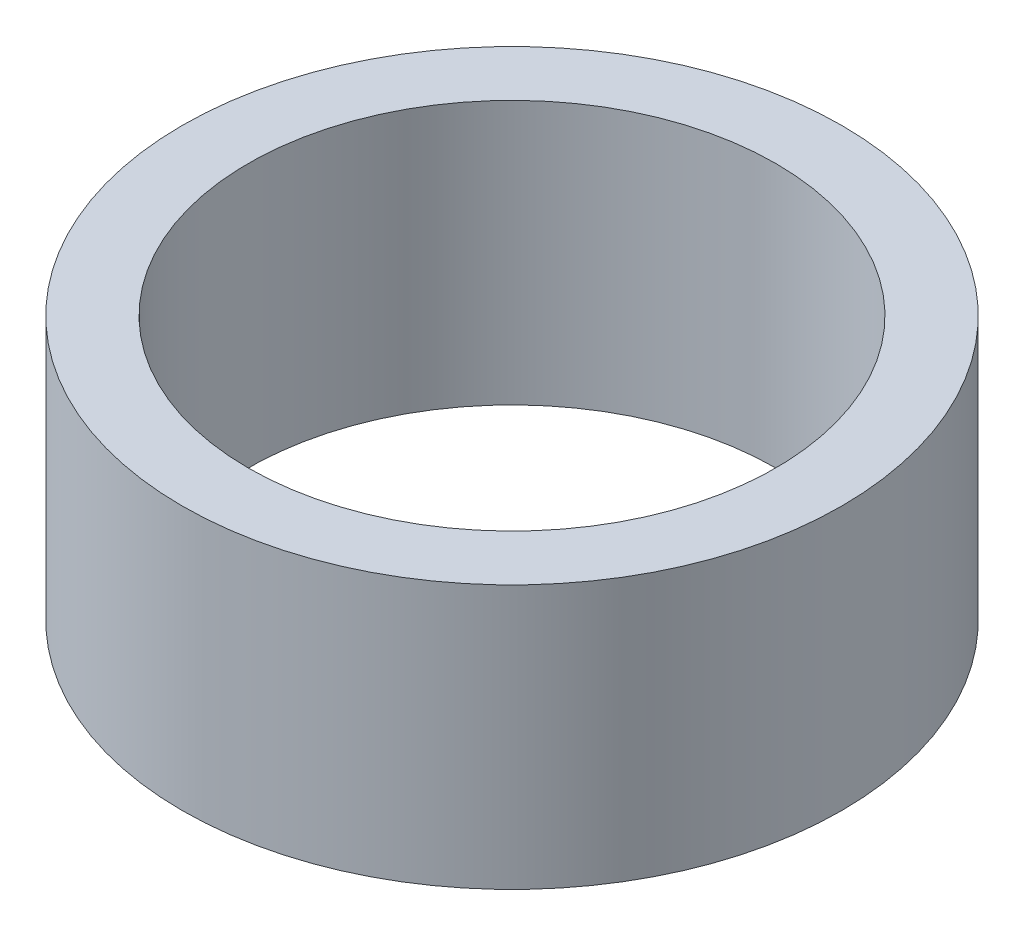
ISO-10303-21;
HEADER;
FILE_DESCRIPTION(('STEP AP214'),'2;1');
FILE_NAME('part.step','',(''),(''),'','','');
FILE_SCHEMA(('AUTOMOTIVE_DESIGN { 1 0 10303 214 1 1 1 1 }'));
ENDSEC;
DATA;
#1=APPLICATION_CONTEXT('core data for automotive mechanical design processes');
#2=APPLICATION_PROTOCOL_DEFINITION('international standard','automotive_design',2000,#1);
#3=PRODUCT_CONTEXT('',#1,'mechanical');
#4=PRODUCT('Part','Part','',(#3));
#5=PRODUCT_RELATED_PRODUCT_CATEGORY('part','',(#4));
#6=PRODUCT_DEFINITION_FORMATION('','',#4);
#7=PRODUCT_DEFINITION_CONTEXT('part definition',#1,'design');
#8=PRODUCT_DEFINITION('design','',#6,#7);
#9=PRODUCT_DEFINITION_SHAPE('','',#8);
#10=(LENGTH_UNIT() NAMED_UNIT(*) SI_UNIT(.MILLI.,.METRE.));
#11=(NAMED_UNIT(*) PLANE_ANGLE_UNIT() SI_UNIT($,.RADIAN.));
#12=(NAMED_UNIT(*) SI_UNIT($,.STERADIAN.) SOLID_ANGLE_UNIT());
#13=UNCERTAINTY_MEASURE_WITH_UNIT(LENGTH_MEASURE(1.E-05),#10,'distance_accuracy_value','');
#14=(GEOMETRIC_REPRESENTATION_CONTEXT(3) GLOBAL_UNCERTAINTY_ASSIGNED_CONTEXT((#13)) GLOBAL_UNIT_ASSIGNED_CONTEXT((#10,
#11,#12)) REPRESENTATION_CONTEXT('',''));
#15=CARTESIAN_POINT('',(0.,0.,0.));
#16=DIRECTION('',(0.,0.,1.));
#17=DIRECTION('',(1.,0.,0.));
#18=AXIS2_PLACEMENT_3D('',#15,#16,#17);
#19=CARTESIAN_POINT('',(0.,50.8,0.));
#20=DIRECTION('',(0.,-1.,0.));
#21=DIRECTION('',(0.,0.,-1.));
#22=AXIS2_PLACEMENT_3D('',#19,#20,#21);
#23=CYLINDRICAL_SURFACE('',#22,63.5);
#24=CARTESIAN_POINT('',(0.,50.8,0.));
#25=DIRECTION('',(0.,1.,0.));
#26=DIRECTION('',(0.,0.,1.));
#27=AXIS2_PLACEMENT_3D('',#24,#25,#26);
#28=CIRCLE('',#27,63.5);
#29=CARTESIAN_POINT('',(0.,50.8,63.5));
#30=VERTEX_POINT('',#29);
#31=EDGE_CURVE('E10',#30,#30,#28,.T.);
#32=ORIENTED_EDGE('',*,*,#31,.F.);
#33=EDGE_LOOP('',(#32));
#34=FACE_BOUND('',#33,.T.);
#35=CARTESIAN_POINT('',(0.,0.,0.));
#36=DIRECTION('',(0.,1.,0.));
#37=DIRECTION('',(0.,0.,1.));
#38=AXIS2_PLACEMENT_3D('',#35,#36,#37);
#39=CIRCLE('',#38,63.5);
#40=CARTESIAN_POINT('',(0.,0.,63.5));
#41=VERTEX_POINT('',#40);
#42=EDGE_CURVE('E44',#41,#41,#39,.T.);
#43=ORIENTED_EDGE('',*,*,#42,.T.);
#44=EDGE_LOOP('',(#43));
#45=FACE_BOUND('',#44,.T.);
#46=ADVANCED_FACE('F41',(#34,#45),#23,.T.);
#47=CARTESIAN_POINT('',(0.,50.8,0.));
#48=DIRECTION('',(0.,1.,0.));
#49=DIRECTION('',(0.,0.,1.));
#50=AXIS2_PLACEMENT_3D('',#47,#48,#49);
#51=PLANE('',#50);
#52=CARTESIAN_POINT('',(0.,50.8,0.));
#53=DIRECTION('',(0.,1.,0.));
#54=DIRECTION('',(0.,0.,1.));
#55=AXIS2_PLACEMENT_3D('',#52,#53,#54);
#56=CIRCLE('',#55,50.8);
#57=CARTESIAN_POINT('',(0.,50.8,50.8));
#58=VERTEX_POINT('',#57);
#59=EDGE_CURVE('E55',#58,#58,#56,.T.);
#60=ORIENTED_EDGE('',*,*,#59,.F.);
#61=EDGE_LOOP('',(#60));
#62=FACE_BOUND('',#61,.T.);
#63=ORIENTED_EDGE('',*,*,#31,.T.);
#64=EDGE_LOOP('',(#63));
#65=FACE_BOUND('',#64,.T.);
#66=ADVANCED_FACE('F72',(#62,#65),#51,.T.);
#67=CARTESIAN_POINT('',(0.,0.,0.));
#68=DIRECTION('',(0.,1.,0.));
#69=DIRECTION('',(0.,0.,1.));
#70=AXIS2_PLACEMENT_3D('',#67,#68,#69);
#71=PLANE('',#70);
#72=CARTESIAN_POINT('',(0.,0.,0.));
#73=DIRECTION('',(0.,1.,0.));
#74=DIRECTION('',(0.,0.,1.));
#75=AXIS2_PLACEMENT_3D('',#72,#73,#74);
#76=CIRCLE('',#75,50.8);
#77=CARTESIAN_POINT('',(0.,0.,50.8));
#78=VERTEX_POINT('',#77);
#79=EDGE_CURVE('E53',#78,#78,#76,.T.);
#80=ORIENTED_EDGE('',*,*,#79,.T.);
#81=EDGE_LOOP('',(#80));
#82=FACE_BOUND('',#81,.T.);
#83=ORIENTED_EDGE('',*,*,#42,.F.);
#84=EDGE_LOOP('',(#83));
#85=FACE_BOUND('',#84,.T.);
#86=ADVANCED_FACE('F63',(#82,#85),#71,.F.);
#87=CARTESIAN_POINT('',(0.,0.,0.));
#88=DIRECTION('',(0.,1.,0.));
#89=DIRECTION('',(0.,0.,1.));
#90=AXIS2_PLACEMENT_3D('',#87,#88,#89);
#91=CYLINDRICAL_SURFACE('',#90,50.8);
#92=ORIENTED_EDGE('',*,*,#79,.F.);
#93=EDGE_LOOP('',(#92));
#94=FACE_BOUND('',#93,.T.);
#95=ORIENTED_EDGE('',*,*,#59,.T.);
#96=EDGE_LOOP('',(#95));
#97=FACE_BOUND('',#96,.T.);
#98=ADVANCED_FACE('F66',(#94,#97),#91,.F.);
#99=CLOSED_SHELL('',(#46,#66,#86,#98));
#100=MANIFOLD_SOLID_BREP('B2',#99);
#101=ADVANCED_BREP_SHAPE_REPRESENTATION('',(#18,#100),#14);
#102=SHAPE_DEFINITION_REPRESENTATION(#9,#101);
ENDSEC;
END-ISO-10303-21;
